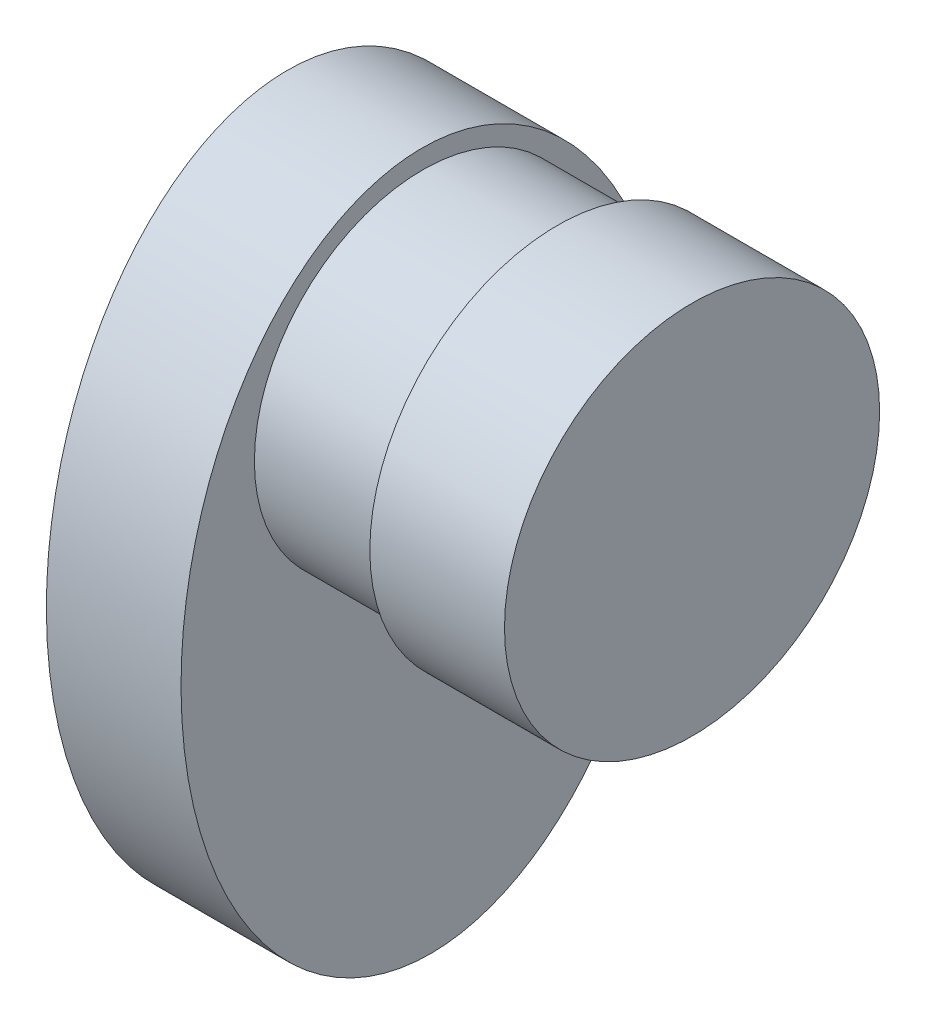
ISO-10303-21;
HEADER;
FILE_DESCRIPTION(('STEP AP214'),'2;1');
FILE_NAME('part.step','',(''),(''),'','','');
FILE_SCHEMA(('AUTOMOTIVE_DESIGN { 1 0 10303 214 1 1 1 1 }'));
ENDSEC;
DATA;
#1=APPLICATION_CONTEXT('core data for automotive mechanical design processes');
#2=APPLICATION_PROTOCOL_DEFINITION('international standard','automotive_design',2000,#1);
#3=PRODUCT_CONTEXT('',#1,'mechanical');
#4=PRODUCT('Part','Part','',(#3));
#5=PRODUCT_RELATED_PRODUCT_CATEGORY('part','',(#4));
#6=PRODUCT_DEFINITION_FORMATION('','',#4);
#7=PRODUCT_DEFINITION_CONTEXT('part definition',#1,'design');
#8=PRODUCT_DEFINITION('design','',#6,#7);
#9=PRODUCT_DEFINITION_SHAPE('','',#8);
#10=(LENGTH_UNIT() NAMED_UNIT(*) SI_UNIT(.MILLI.,.METRE.));
#11=(NAMED_UNIT(*) PLANE_ANGLE_UNIT() SI_UNIT($,.RADIAN.));
#12=(NAMED_UNIT(*) SI_UNIT($,.STERADIAN.) SOLID_ANGLE_UNIT());
#13=UNCERTAINTY_MEASURE_WITH_UNIT(LENGTH_MEASURE(1.E-05),#10,'distance_accuracy_value','');
#14=(GEOMETRIC_REPRESENTATION_CONTEXT(3) GLOBAL_UNCERTAINTY_ASSIGNED_CONTEXT((#13)) GLOBAL_UNIT_ASSIGNED_CONTEXT((#10,
#11,#12)) REPRESENTATION_CONTEXT('',''));
#15=CARTESIAN_POINT('',(0.,0.,0.));
#16=DIRECTION('',(0.,0.,1.));
#17=DIRECTION('',(1.,0.,0.));
#18=AXIS2_PLACEMENT_3D('',#15,#16,#17);
#19=CARTESIAN_POINT('',(-355.6,0.,0.));
#20=DIRECTION('',(1.,0.,0.));
#21=DIRECTION('',(0.,0.,-1.));
#22=AXIS2_PLACEMENT_3D('',#19,#20,#21);
#23=CYLINDRICAL_SURFACE('',#22,495.3);
#24=CARTESIAN_POINT('',(-355.6,0.,0.));
#25=DIRECTION('',(1.,0.,0.));
#26=DIRECTION('',(0.,0.,-1.));
#27=AXIS2_PLACEMENT_3D('',#24,#25,#26);
#28=CIRCLE('',#27,495.3);
#29=CARTESIAN_POINT('',(-355.6,0.,-495.3));
#30=VERTEX_POINT('',#29);
#31=EDGE_CURVE('E38',#30,#30,#28,.T.);
#32=ORIENTED_EDGE('',*,*,#31,.T.);
#33=EDGE_LOOP('',(#32));
#34=FACE_BOUND('',#33,.T.);
#35=CARTESIAN_POINT('',(0.,0.,0.));
#36=DIRECTION('',(1.,0.,0.));
#37=DIRECTION('',(0.,0.,-1.));
#38=AXIS2_PLACEMENT_3D('',#35,#36,#37);
#39=CIRCLE('',#38,495.3);
#40=CARTESIAN_POINT('',(0.,0.,-495.3));
#41=VERTEX_POINT('',#40);
#42=EDGE_CURVE('E34',#41,#41,#39,.T.);
#43=ORIENTED_EDGE('',*,*,#42,.F.);
#44=EDGE_LOOP('',(#43));
#45=FACE_BOUND('',#44,.T.);
#46=ADVANCED_FACE('F31',(#34,#45),#23,.T.);
#47=CARTESIAN_POINT('',(-355.6,0.,0.));
#48=DIRECTION('',(1.,0.,0.));
#49=DIRECTION('',(0.,0.,-1.));
#50=AXIS2_PLACEMENT_3D('',#47,#48,#49);
#51=PLANE('',#50);
#52=CARTESIAN_POINT('',(-355.6,0.,0.));
#53=DIRECTION('',(-1.,0.,0.));
#54=DIRECTION('',(0.,0.,1.));
#55=AXIS2_PLACEMENT_3D('',#52,#53,#54);
#56=CIRCLE('',#55,444.5);
#57=CARTESIAN_POINT('',(-355.6,0.,444.5));
#58=VERTEX_POINT('',#57);
#59=EDGE_CURVE('E10',#58,#58,#56,.T.);
#60=ORIENTED_EDGE('',*,*,#59,.F.);
#61=EDGE_LOOP('',(#60));
#62=FACE_BOUND('',#61,.T.);
#63=ORIENTED_EDGE('',*,*,#31,.F.);
#64=EDGE_LOOP('',(#63));
#65=FACE_BOUND('',#64,.T.);
#66=ADVANCED_FACE('F67',(#62,#65),#51,.F.);
#67=CARTESIAN_POINT('',(0.,0.,0.));
#68=DIRECTION('',(1.,0.,0.));
#69=DIRECTION('',(0.,0.,-1.));
#70=AXIS2_PLACEMENT_3D('',#67,#68,#69);
#71=PLANE('',#70);
#72=ORIENTED_EDGE('',*,*,#42,.T.);
#73=EDGE_LOOP('',(#72));
#74=FACE_BOUND('',#73,.T.);
#75=ADVANCED_FACE('F65',(#74),#71,.T.);
#76=CARTESIAN_POINT('',(-711.2,0.,0.));
#77=DIRECTION('',(1.,0.,0.));
#78=DIRECTION('',(0.,0.,-1.));
#79=AXIS2_PLACEMENT_3D('',#76,#77,#78);
#80=CYLINDRICAL_SURFACE('',#79,444.5);
#81=CARTESIAN_POINT('',(-711.2,0.,0.));
#82=DIRECTION('',(-1.,0.,0.));
#83=DIRECTION('',(0.,0.,1.));
#84=AXIS2_PLACEMENT_3D('',#81,#82,#83);
#85=CIRCLE('',#84,444.5);
#86=CARTESIAN_POINT('',(-711.2,0.,444.5));
#87=VERTEX_POINT('',#86);
#88=EDGE_CURVE('E44',#87,#87,#85,.T.);
#89=ORIENTED_EDGE('',*,*,#88,.F.);
#90=EDGE_LOOP('',(#89));
#91=FACE_BOUND('',#90,.T.);
#92=ORIENTED_EDGE('',*,*,#59,.T.);
#93=EDGE_LOOP('',(#92));
#94=FACE_BOUND('',#93,.T.);
#95=ADVANCED_FACE('F59',(#91,#94),#80,.T.);
#96=CARTESIAN_POINT('',(-1066.8,-431.69241616461,-9.63835182805122));
#97=DIRECTION('',(-1.,0.,0.));
#98=DIRECTION('',(0.,0.999750847995854,0.0223213335526893));
#99=AXIS2_PLACEMENT_3D('',#96,#97,#98);
#100=ELLIPSE('',#99,927.1,647.7);
#101=DIRECTION('',(1.,0.,0.));
#102=VECTOR('',#101,1.);
#103=SURFACE_OF_LINEAR_EXTRUSION('',#100,#102);
#104=CARTESIAN_POINT('',(-1066.8,495.176595012347,11.055756508647));
#105=VERTEX_POINT('',#104);
#106=EDGE_CURVE('E47',#105,#105,#100,.T.);
#107=ORIENTED_EDGE('',*,*,#106,.F.);
#108=EDGE_LOOP('',(#107));
#109=FACE_BOUND('',#108,.T.);
#110=CARTESIAN_POINT('',(-711.2,-431.69241616461,-9.63835182805122));
#111=DIRECTION('',(-1.,0.,0.));
#112=DIRECTION('',(0.,0.999750847995854,0.0223213335526893));
#113=AXIS2_PLACEMENT_3D('',#110,#111,#112);
#114=ELLIPSE('',#113,927.1,647.7);
#115=CARTESIAN_POINT('',(-711.2,495.176595012347,11.055756508647));
#116=VERTEX_POINT('',#115);
#117=EDGE_CURVE('E48',#116,#116,#114,.T.);
#118=ORIENTED_EDGE('',*,*,#117,.T.);
#119=EDGE_LOOP('',(#118));
#120=FACE_BOUND('',#119,.T.);
#121=ADVANCED_FACE('F54',(#109,#120),#103,.F.);
#122=CARTESIAN_POINT('',(-1066.8,-431.69241616461,-9.63835182805122));
#123=DIRECTION('',(-1.,0.,0.));
#124=DIRECTION('',(0.,0.,1.));
#125=AXIS2_PLACEMENT_3D('',#122,#123,#124);
#126=PLANE('',#125);
#127=ORIENTED_EDGE('',*,*,#106,.T.);
#128=EDGE_LOOP('',(#127));
#129=FACE_BOUND('',#128,.T.);
#130=ADVANCED_FACE('F58',(#129),#126,.T.);
#131=CARTESIAN_POINT('',(-711.2,-431.69241616461,-9.63835182805122));
#132=DIRECTION('',(-1.,0.,0.));
#133=DIRECTION('',(0.,0.,1.));
#134=AXIS2_PLACEMENT_3D('',#131,#132,#133);
#135=PLANE('',#134);
#136=ORIENTED_EDGE('',*,*,#88,.T.);
#137=EDGE_LOOP('',(#136));
#138=FACE_BOUND('',#137,.T.);
#139=ORIENTED_EDGE('',*,*,#117,.F.);
#140=EDGE_LOOP('',(#139));
#141=FACE_BOUND('',#140,.T.);
#142=ADVANCED_FACE('F61',(#138,#141),#135,.F.);
#143=CLOSED_SHELL('',(#46,#66,#75,#95,#121,#130,#142));
#144=MANIFOLD_SOLID_BREP('B2',#143);
#145=ADVANCED_BREP_SHAPE_REPRESENTATION('',(#18,#144),#14);
#146=SHAPE_DEFINITION_REPRESENTATION(#9,#145);
ENDSEC;
END-ISO-10303-21;
